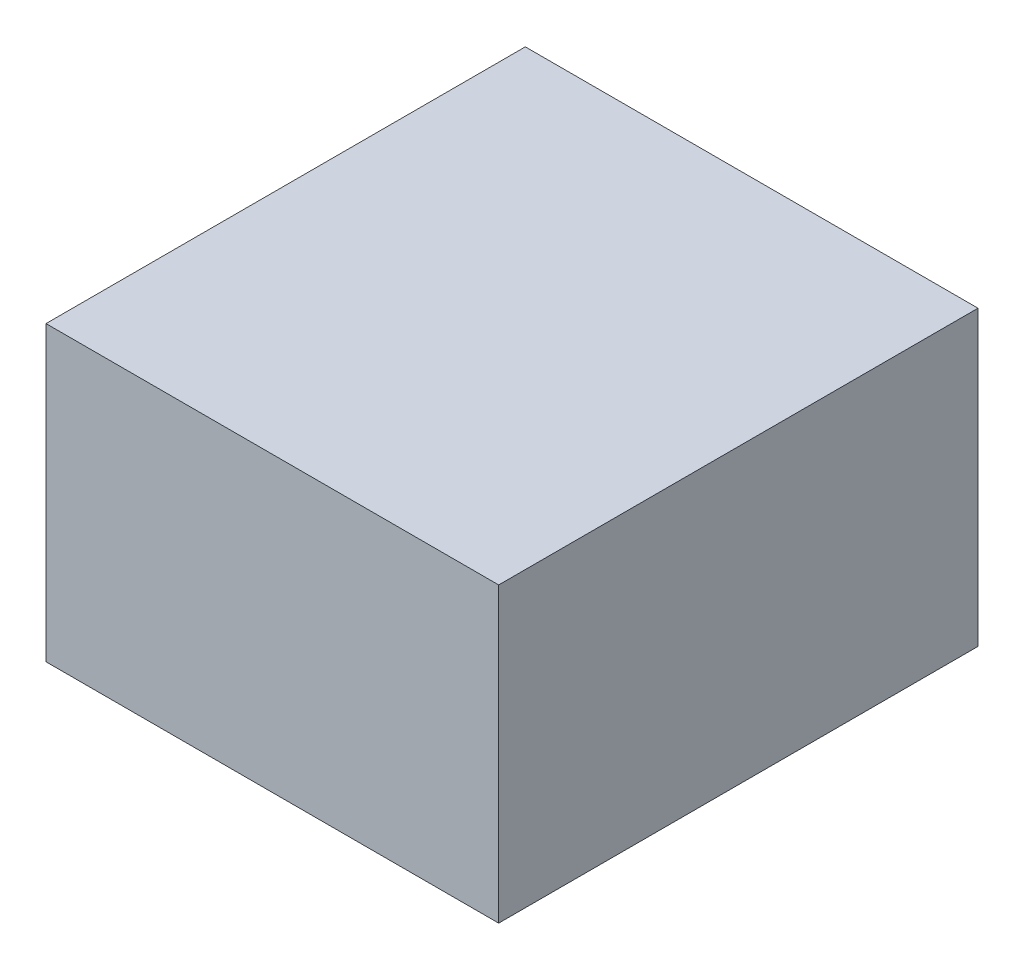
ISO-10303-21;
HEADER;
FILE_DESCRIPTION(('STEP AP214'),'2;1');
FILE_NAME('part.step','',(''),(''),'','','');
FILE_SCHEMA(('AUTOMOTIVE_DESIGN { 1 0 10303 214 1 1 1 1 }'));
ENDSEC;
DATA;
#1=APPLICATION_CONTEXT('core data for automotive mechanical design processes');
#2=APPLICATION_PROTOCOL_DEFINITION('international standard','automotive_design',2000,#1);
#3=PRODUCT_CONTEXT('',#1,'mechanical');
#4=PRODUCT('Part','Part','',(#3));
#5=PRODUCT_RELATED_PRODUCT_CATEGORY('part','',(#4));
#6=PRODUCT_DEFINITION_FORMATION('','',#4);
#7=PRODUCT_DEFINITION_CONTEXT('part definition',#1,'design');
#8=PRODUCT_DEFINITION('design','',#6,#7);
#9=PRODUCT_DEFINITION_SHAPE('','',#8);
#10=(LENGTH_UNIT() NAMED_UNIT(*) SI_UNIT(.MILLI.,.METRE.));
#11=(NAMED_UNIT(*) PLANE_ANGLE_UNIT() SI_UNIT($,.RADIAN.));
#12=(NAMED_UNIT(*) SI_UNIT($,.STERADIAN.) SOLID_ANGLE_UNIT());
#13=UNCERTAINTY_MEASURE_WITH_UNIT(LENGTH_MEASURE(1.E-05),#10,'distance_accuracy_value','');
#14=(GEOMETRIC_REPRESENTATION_CONTEXT(3) GLOBAL_UNCERTAINTY_ASSIGNED_CONTEXT((#13)) GLOBAL_UNIT_ASSIGNED_CONTEXT((#10,
#11,#12)) REPRESENTATION_CONTEXT('',''));
#15=CARTESIAN_POINT('',(0.,0.,0.));
#16=DIRECTION('',(0.,0.,1.));
#17=DIRECTION('',(1.,0.,0.));
#18=AXIS2_PLACEMENT_3D('',#15,#16,#17);
#19=CARTESIAN_POINT('',(-170.,220.,-180.));
#20=DIRECTION('',(1.,0.,0.));
#21=DIRECTION('',(0.,0.,-1.));
#22=AXIS2_PLACEMENT_3D('',#19,#20,#21);
#23=PLANE('',#22);
#24=DIRECTION('',(0.,0.,1.));
#25=VECTOR('',#24,1.);
#26=CARTESIAN_POINT('',(-170.,0.,-180.));
#27=LINE('',#26,#25);
#28=CARTESIAN_POINT('',(-170.,0.,-180.));
#29=VERTEX_POINT('',#28);
#30=CARTESIAN_POINT('',(-170.,0.,180.));
#31=VERTEX_POINT('',#30);
#32=EDGE_CURVE('E97',#29,#31,#27,.T.);
#33=ORIENTED_EDGE('',*,*,#32,.T.);
#34=DIRECTION('',(0.,-1.,0.));
#35=VECTOR('',#34,1.);
#36=CARTESIAN_POINT('',(-170.,220.,180.));
#37=LINE('',#36,#35);
#38=CARTESIAN_POINT('',(-170.,220.,180.));
#39=VERTEX_POINT('',#38);
#40=EDGE_CURVE('E11',#39,#31,#37,.T.);
#41=ORIENTED_EDGE('',*,*,#40,.F.);
#42=DIRECTION('',(0.,0.,1.));
#43=VECTOR('',#42,1.);
#44=CARTESIAN_POINT('',(-170.,220.,-180.));
#45=LINE('',#44,#43);
#46=CARTESIAN_POINT('',(-170.,220.,-180.));
#47=VERTEX_POINT('',#46);
#48=EDGE_CURVE('E85',#47,#39,#45,.T.);
#49=ORIENTED_EDGE('',*,*,#48,.F.);
#50=DIRECTION('',(0.,-1.,0.));
#51=VECTOR('',#50,1.);
#52=CARTESIAN_POINT('',(-170.,220.,-180.));
#53=LINE('',#52,#51);
#54=EDGE_CURVE('E93',#47,#29,#53,.T.);
#55=ORIENTED_EDGE('',*,*,#54,.T.);
#56=EDGE_LOOP('',(#33,#41,#49,#55));
#57=FACE_BOUND('',#56,.T.);
#58=ADVANCED_FACE('F34',(#57),#23,.F.);
#59=CARTESIAN_POINT('',(-170.,220.,180.));
#60=DIRECTION('',(0.,0.,-1.));
#61=DIRECTION('',(-1.,0.,0.));
#62=AXIS2_PLACEMENT_3D('',#59,#60,#61);
#63=PLANE('',#62);
#64=DIRECTION('',(1.,0.,0.));
#65=VECTOR('',#64,1.);
#66=CARTESIAN_POINT('',(-170.,0.,180.));
#67=LINE('',#66,#65);
#68=CARTESIAN_POINT('',(170.,0.,180.));
#69=VERTEX_POINT('',#68);
#70=EDGE_CURVE('E89',#31,#69,#67,.T.);
#71=ORIENTED_EDGE('',*,*,#70,.T.);
#72=DIRECTION('',(0.,-1.,0.));
#73=VECTOR('',#72,1.);
#74=CARTESIAN_POINT('',(170.,220.,180.));
#75=LINE('',#74,#73);
#76=CARTESIAN_POINT('',(170.,220.,180.));
#77=VERTEX_POINT('',#76);
#78=EDGE_CURVE('E42',#77,#69,#75,.T.);
#79=ORIENTED_EDGE('',*,*,#78,.F.);
#80=DIRECTION('',(1.,0.,0.));
#81=VECTOR('',#80,1.);
#82=CARTESIAN_POINT('',(-170.,220.,180.));
#83=LINE('',#82,#81);
#84=EDGE_CURVE('E80',#39,#77,#83,.T.);
#85=ORIENTED_EDGE('',*,*,#84,.F.);
#86=ORIENTED_EDGE('',*,*,#40,.T.);
#87=EDGE_LOOP('',(#71,#79,#85,#86));
#88=FACE_BOUND('',#87,.T.);
#89=ADVANCED_FACE('F88',(#88),#63,.F.);
#90=CARTESIAN_POINT('',(170.,220.,-180.));
#91=DIRECTION('',(-1.,0.,0.));
#92=DIRECTION('',(0.,0.,1.));
#93=AXIS2_PLACEMENT_3D('',#90,#91,#92);
#94=PLANE('',#93);
#95=DIRECTION('',(0.,0.,-1.));
#96=VECTOR('',#95,1.);
#97=CARTESIAN_POINT('',(170.,0.,-180.));
#98=LINE('',#97,#96);
#99=CARTESIAN_POINT('',(170.,0.,-180.));
#100=VERTEX_POINT('',#99);
#101=EDGE_CURVE('E67',#69,#100,#98,.T.);
#102=ORIENTED_EDGE('',*,*,#101,.T.);
#103=DIRECTION('',(0.,-1.,0.));
#104=VECTOR('',#103,1.);
#105=CARTESIAN_POINT('',(170.,220.,-180.));
#106=LINE('',#105,#104);
#107=CARTESIAN_POINT('',(170.,220.,-180.));
#108=VERTEX_POINT('',#107);
#109=EDGE_CURVE('E90',#108,#100,#106,.T.);
#110=ORIENTED_EDGE('',*,*,#109,.F.);
#111=DIRECTION('',(0.,0.,-1.));
#112=VECTOR('',#111,1.);
#113=CARTESIAN_POINT('',(170.,220.,-180.));
#114=LINE('',#113,#112);
#115=EDGE_CURVE('E83',#77,#108,#114,.T.);
#116=ORIENTED_EDGE('',*,*,#115,.F.);
#117=ORIENTED_EDGE('',*,*,#78,.T.);
#118=EDGE_LOOP('',(#102,#110,#116,#117));
#119=FACE_BOUND('',#118,.T.);
#120=ADVANCED_FACE('F91',(#119),#94,.F.);
#121=CARTESIAN_POINT('',(-170.,220.,-180.));
#122=DIRECTION('',(0.,0.,1.));
#123=DIRECTION('',(1.,0.,0.));
#124=AXIS2_PLACEMENT_3D('',#121,#122,#123);
#125=PLANE('',#124);
#126=DIRECTION('',(-1.,0.,0.));
#127=VECTOR('',#126,1.);
#128=CARTESIAN_POINT('',(-170.,0.,-180.));
#129=LINE('',#128,#127);
#130=EDGE_CURVE('E73',#100,#29,#129,.T.);
#131=ORIENTED_EDGE('',*,*,#130,.T.);
#132=ORIENTED_EDGE('',*,*,#54,.F.);
#133=DIRECTION('',(-1.,0.,0.));
#134=VECTOR('',#133,1.);
#135=CARTESIAN_POINT('',(-170.,220.,-180.));
#136=LINE('',#135,#134);
#137=EDGE_CURVE('E50',#108,#47,#136,.T.);
#138=ORIENTED_EDGE('',*,*,#137,.F.);
#139=ORIENTED_EDGE('',*,*,#109,.T.);
#140=EDGE_LOOP('',(#131,#132,#138,#139));
#141=FACE_BOUND('',#140,.T.);
#142=ADVANCED_FACE('F104',(#141),#125,.F.);
#143=CARTESIAN_POINT('',(0.,220.,0.));
#144=DIRECTION('',(0.,1.,0.));
#145=DIRECTION('',(0.,0.,1.));
#146=AXIS2_PLACEMENT_3D('',#143,#144,#145);
#147=PLANE('',#146);
#148=ORIENTED_EDGE('',*,*,#48,.T.);
#149=ORIENTED_EDGE('',*,*,#84,.T.);
#150=ORIENTED_EDGE('',*,*,#115,.T.);
#151=ORIENTED_EDGE('',*,*,#137,.T.);
#152=EDGE_LOOP('',(#148,#149,#150,#151));
#153=FACE_BOUND('',#152,.T.);
#154=ADVANCED_FACE('F81',(#153),#147,.T.);
#155=CARTESIAN_POINT('',(0.,0.,0.));
#156=DIRECTION('',(0.,1.,0.));
#157=DIRECTION('',(0.,0.,1.));
#158=AXIS2_PLACEMENT_3D('',#155,#156,#157);
#159=PLANE('',#158);
#160=ORIENTED_EDGE('',*,*,#32,.F.);
#161=ORIENTED_EDGE('',*,*,#130,.F.);
#162=ORIENTED_EDGE('',*,*,#101,.F.);
#163=ORIENTED_EDGE('',*,*,#70,.F.);
#164=EDGE_LOOP('',(#160,#161,#162,#163));
#165=FACE_BOUND('',#164,.T.);
#166=ADVANCED_FACE('F107',(#165),#159,.F.);
#167=CLOSED_SHELL('',(#58,#89,#120,#142,#154,#166));
#168=MANIFOLD_SOLID_BREP('B2',#167);
#169=ADVANCED_BREP_SHAPE_REPRESENTATION('',(#18,#168),#14);
#170=SHAPE_DEFINITION_REPRESENTATION(#9,#169);
ENDSEC;
END-ISO-10303-21;
